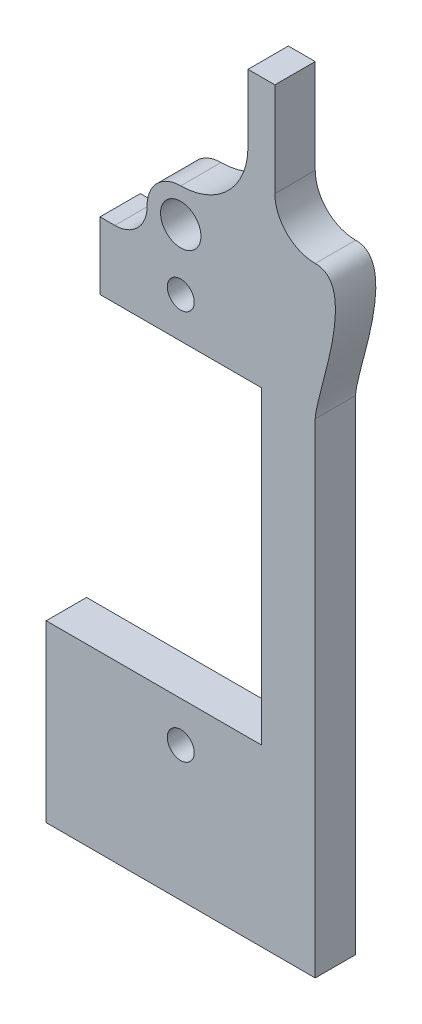
ISO-10303-21;
HEADER;
FILE_DESCRIPTION(('STEP AP214'),'2;1');
FILE_NAME('part.step','',(''),(''),'','','');
FILE_SCHEMA(('AUTOMOTIVE_DESIGN { 1 0 10303 214 1 1 1 1 }'));
ENDSEC;
DATA;
#1=APPLICATION_CONTEXT('core data for automotive mechanical design processes');
#2=APPLICATION_PROTOCOL_DEFINITION('international standard','automotive_design',2000,#1);
#3=PRODUCT_CONTEXT('',#1,'mechanical');
#4=PRODUCT('Part','Part','',(#3));
#5=PRODUCT_RELATED_PRODUCT_CATEGORY('part','',(#4));
#6=PRODUCT_DEFINITION_FORMATION('','',#4);
#7=PRODUCT_DEFINITION_CONTEXT('part definition',#1,'design');
#8=PRODUCT_DEFINITION('design','',#6,#7);
#9=PRODUCT_DEFINITION_SHAPE('','',#8);
#10=(LENGTH_UNIT() NAMED_UNIT(*) SI_UNIT(.MILLI.,.METRE.));
#11=(NAMED_UNIT(*) PLANE_ANGLE_UNIT() SI_UNIT($,.RADIAN.));
#12=(NAMED_UNIT(*) SI_UNIT($,.STERADIAN.) SOLID_ANGLE_UNIT());
#13=UNCERTAINTY_MEASURE_WITH_UNIT(LENGTH_MEASURE(1.E-05),#10,'distance_accuracy_value','');
#14=(GEOMETRIC_REPRESENTATION_CONTEXT(3) GLOBAL_UNCERTAINTY_ASSIGNED_CONTEXT((#13)) GLOBAL_UNIT_ASSIGNED_CONTEXT((#10,
#11,#12)) REPRESENTATION_CONTEXT('',''));
#15=CARTESIAN_POINT('',(0.,0.,0.));
#16=DIRECTION('',(0.,0.,1.));
#17=DIRECTION('',(1.,0.,0.));
#18=AXIS2_PLACEMENT_3D('',#15,#16,#17);
#19=CARTESIAN_POINT('',(-4.9,37.4,3.));
#20=DIRECTION('',(0.,0.,1.));
#21=DIRECTION('',(1.,0.,0.));
#22=AXIS2_PLACEMENT_3D('',#19,#20,#21);
#23=PLANE('',#22);
#24=CARTESIAN_POINT('',(0.,33.,3.));
#25=DIRECTION('',(0.,0.,1.));
#26=DIRECTION('',(1.,0.,0.));
#27=AXIS2_PLACEMENT_3D('',#24,#25,#26);
#28=CIRCLE('',#27,1.);
#29=CARTESIAN_POINT('',(1.,33.,3.));
#30=VERTEX_POINT('',#29);
#31=EDGE_CURVE('E404',#30,#30,#28,.T.);
#32=ORIENTED_EDGE('',*,*,#31,.F.);
#33=EDGE_LOOP('',(#32));
#34=FACE_BOUND('',#33,.T.);
#35=DIRECTION('',(0.,1.,0.));
#36=VECTOR('',#35,1.);
#37=CARTESIAN_POINT('',(10.,0.,3.));
#38=LINE('',#37,#36);
#39=CARTESIAN_POINT('',(9.99999999999999,-5.99999999999999,3.));
#40=VERTEX_POINT('',#39);
#41=CARTESIAN_POINT('',(10.,30.,3.));
#42=VERTEX_POINT('',#41);
#43=EDGE_CURVE('E117',#40,#42,#38,.T.);
#44=ORIENTED_EDGE('',*,*,#43,.T.);
#45=CARTESIAN_POINT('',(9.99999999999999,30.,3.));
#46=CARTESIAN_POINT('',(10.,31.6044227574687,3.));
#47=CARTESIAN_POINT('',(13.3824564635064,40.,3.));
#48=CARTESIAN_POINT('',(10.,40.,3.));
#49=B_SPLINE_CURVE_WITH_KNOTS('',3,(#45,#46,#47,#48),.UNSPECIFIED.,.F.,.F.,(4,4),(0.,1.),.UNSPECIFIED.);
#50=CARTESIAN_POINT('',(10.,40.,3.));
#51=VERTEX_POINT('',#50);
#52=EDGE_CURVE('E314',#42,#51,#49,.T.);
#53=ORIENTED_EDGE('',*,*,#52,.T.);
#54=CARTESIAN_POINT('',(10.,43.,3.));
#55=DIRECTION('',(0.,0.,-1.));
#56=DIRECTION('',(1.,0.,0.));
#57=AXIS2_PLACEMENT_3D('',#54,#55,#56);
#58=CIRCLE('',#57,3.);
#59=CARTESIAN_POINT('',(7.,43.,3.));
#60=VERTEX_POINT('',#59);
#61=EDGE_CURVE('E263',#51,#60,#58,.T.);
#62=ORIENTED_EDGE('',*,*,#61,.T.);
#63=DIRECTION('',(0.,1.,0.));
#64=VECTOR('',#63,1.);
#65=CARTESIAN_POINT('',(7.,50.,3.));
#66=LINE('',#65,#64);
#67=CARTESIAN_POINT('',(7.,50.,3.));
#68=VERTEX_POINT('',#67);
#69=EDGE_CURVE('E282',#60,#68,#66,.T.);
#70=ORIENTED_EDGE('',*,*,#69,.T.);
#71=DIRECTION('',(-1.,0.,0.));
#72=VECTOR('',#71,1.);
#73=CARTESIAN_POINT('',(5.,50.,3.));
#74=LINE('',#73,#72);
#75=CARTESIAN_POINT('',(5.,50.,3.));
#76=VERTEX_POINT('',#75);
#77=EDGE_CURVE('E279',#68,#76,#74,.T.);
#78=ORIENTED_EDGE('',*,*,#77,.T.);
#79=DIRECTION('',(0.,-1.,0.));
#80=VECTOR('',#79,1.);
#81=CARTESIAN_POINT('',(5.,45.,3.));
#82=LINE('',#81,#80);
#83=CARTESIAN_POINT('',(5.,45.,3.));
#84=VERTEX_POINT('',#83);
#85=EDGE_CURVE('E281',#76,#84,#82,.T.);
#86=ORIENTED_EDGE('',*,*,#85,.T.);
#87=CARTESIAN_POINT('',(0.,45.,3.));
#88=DIRECTION('',(0.,0.,-1.));
#89=DIRECTION('',(1.,0.,0.));
#90=AXIS2_PLACEMENT_3D('',#87,#88,#89);
#91=CIRCLE('',#90,5.);
#92=CARTESIAN_POINT('',(0.,40.,3.));
#93=VERTEX_POINT('',#92);
#94=EDGE_CURVE('E284',#84,#93,#91,.T.);
#95=ORIENTED_EDGE('',*,*,#94,.T.);
#96=CARTESIAN_POINT('',(0.,37.5,3.));
#97=DIRECTION('',(0.,0.,1.));
#98=DIRECTION('',(1.,0.,0.));
#99=AXIS2_PLACEMENT_3D('',#96,#97,#98);
#100=CIRCLE('',#99,2.5);
#101=CARTESIAN_POINT('',(-2.49999999999999,37.5,3.));
#102=VERTEX_POINT('',#101);
#103=EDGE_CURVE('E290',#93,#102,#100,.T.);
#104=ORIENTED_EDGE('',*,*,#103,.T.);
#105=DIRECTION('',(0.,-1.,0.));
#106=VECTOR('',#105,1.);
#107=CARTESIAN_POINT('',(-2.49999999999999,37.4,3.));
#108=LINE('',#107,#106);
#109=CARTESIAN_POINT('',(-2.49999999999999,37.4,3.));
#110=VERTEX_POINT('',#109);
#111=EDGE_CURVE('E292',#102,#110,#108,.T.);
#112=ORIENTED_EDGE('',*,*,#111,.T.);
#113=CARTESIAN_POINT('',(-4.9,37.4,3.));
#114=DIRECTION('',(0.,0.,-1.));
#115=DIRECTION('',(1.,0.,0.));
#116=AXIS2_PLACEMENT_3D('',#113,#114,#115);
#117=CIRCLE('',#116,2.4);
#118=CARTESIAN_POINT('',(-4.90000000000001,35.,3.));
#119=VERTEX_POINT('',#118);
#120=EDGE_CURVE('E294',#110,#119,#117,.T.);
#121=ORIENTED_EDGE('',*,*,#120,.T.);
#122=DIRECTION('',(-1.,0.,0.));
#123=VECTOR('',#122,1.);
#124=CARTESIAN_POINT('',(-6.,35.,3.));
#125=LINE('',#124,#123);
#126=CARTESIAN_POINT('',(-6.,35.,3.));
#127=VERTEX_POINT('',#126);
#128=EDGE_CURVE('E296',#119,#127,#125,.T.);
#129=ORIENTED_EDGE('',*,*,#128,.T.);
#130=DIRECTION('',(0.,-1.,0.));
#131=VECTOR('',#130,1.);
#132=CARTESIAN_POINT('',(-6.,35.,3.));
#133=LINE('',#132,#131);
#134=CARTESIAN_POINT('',(-6.,30.,3.));
#135=VERTEX_POINT('',#134);
#136=EDGE_CURVE('E298',#127,#135,#133,.T.);
#137=ORIENTED_EDGE('',*,*,#136,.T.);
#138=DIRECTION('',(1.,0.,0.));
#139=VECTOR('',#138,1.);
#140=CARTESIAN_POINT('',(-6.,30.,3.));
#141=LINE('',#140,#139);
#142=CARTESIAN_POINT('',(6.,30.,3.));
#143=VERTEX_POINT('',#142);
#144=EDGE_CURVE('E300',#135,#143,#141,.T.);
#145=ORIENTED_EDGE('',*,*,#144,.T.);
#146=DIRECTION('',(0.,-1.,0.));
#147=VECTOR('',#146,1.);
#148=CARTESIAN_POINT('',(6.,30.,3.));
#149=LINE('',#148,#147);
#150=CARTESIAN_POINT('',(6.,7.,3.));
#151=VERTEX_POINT('',#150);
#152=EDGE_CURVE('E164',#143,#151,#149,.T.);
#153=ORIENTED_EDGE('',*,*,#152,.T.);
#154=DIRECTION('',(-1.,0.,0.));
#155=VECTOR('',#154,1.);
#156=CARTESIAN_POINT('',(6.,7.,3.));
#157=LINE('',#156,#155);
#158=CARTESIAN_POINT('',(-10.,7.,3.));
#159=VERTEX_POINT('',#158);
#160=EDGE_CURVE('E158',#151,#159,#157,.T.);
#161=ORIENTED_EDGE('',*,*,#160,.T.);
#162=DIRECTION('',(0.,-1.,0.));
#163=VECTOR('',#162,1.);
#164=CARTESIAN_POINT('',(-10.,0.,3.));
#165=LINE('',#164,#163);
#166=CARTESIAN_POINT('',(-9.99999999999999,-5.99999999999999,3.));
#167=VERTEX_POINT('',#166);
#168=EDGE_CURVE('E162',#159,#167,#165,.T.);
#169=ORIENTED_EDGE('',*,*,#168,.T.);
#170=DIRECTION('',(1.,0.,0.));
#171=VECTOR('',#170,1.);
#172=CARTESIAN_POINT('',(-9.99999999999999,-5.99999999999999,3.));
#173=LINE('',#172,#171);
#174=EDGE_CURVE('E49',#167,#40,#173,.T.);
#175=ORIENTED_EDGE('',*,*,#174,.T.);
#176=EDGE_LOOP('',(#44,#53,#62,#70,#78,#86,#95,#104,#112,#121,#129,#137,#145,#153,#161,#169,#175));
#177=FACE_BOUND('',#176,.T.);
#178=CARTESIAN_POINT('',(0.,37.5,3.));
#179=DIRECTION('',(0.,0.,1.));
#180=DIRECTION('',(1.,0.,0.));
#181=AXIS2_PLACEMENT_3D('',#178,#179,#180);
#182=CIRCLE('',#181,1.5);
#183=CARTESIAN_POINT('',(1.5,37.5,3.));
#184=VERTEX_POINT('',#183);
#185=EDGE_CURVE('E185',#184,#184,#182,.T.);
#186=ORIENTED_EDGE('',*,*,#185,.F.);
#187=EDGE_LOOP('',(#186));
#188=FACE_BOUND('',#187,.T.);
#189=CARTESIAN_POINT('',(0.,4.,3.));
#190=DIRECTION('',(0.,0.,1.));
#191=DIRECTION('',(1.,0.,0.));
#192=AXIS2_PLACEMENT_3D('',#189,#190,#191);
#193=CIRCLE('',#192,1.);
#194=CARTESIAN_POINT('',(1.,4.,3.));
#195=VERTEX_POINT('',#194);
#196=EDGE_CURVE('E395',#195,#195,#193,.T.);
#197=ORIENTED_EDGE('',*,*,#196,.F.);
#198=EDGE_LOOP('',(#197));
#199=FACE_BOUND('',#198,.T.);
#200=ADVANCED_FACE('F32',(#34,#177,#188,#199),#23,.T.);
#201=CARTESIAN_POINT('',(-4.9,37.4,0.));
#202=DIRECTION('',(0.,0.,1.));
#203=DIRECTION('',(1.,0.,0.));
#204=AXIS2_PLACEMENT_3D('',#201,#202,#203);
#205=PLANE('',#204);
#206=CARTESIAN_POINT('',(0.,33.,0.));
#207=DIRECTION('',(0.,0.,1.));
#208=DIRECTION('',(1.,0.,0.));
#209=AXIS2_PLACEMENT_3D('',#206,#207,#208);
#210=CIRCLE('',#209,1.);
#211=CARTESIAN_POINT('',(1.,33.,0.));
#212=VERTEX_POINT('',#211);
#213=EDGE_CURVE('E401',#212,#212,#210,.T.);
#214=ORIENTED_EDGE('',*,*,#213,.T.);
#215=EDGE_LOOP('',(#214));
#216=FACE_BOUND('',#215,.T.);
#217=DIRECTION('',(0.,1.,0.));
#218=VECTOR('',#217,1.);
#219=CARTESIAN_POINT('',(10.,0.,0.));
#220=LINE('',#219,#218);
#221=CARTESIAN_POINT('',(9.99999999999999,-5.99999999999999,0.));
#222=VERTEX_POINT('',#221);
#223=CARTESIAN_POINT('',(10.,30.,0.));
#224=VERTEX_POINT('',#223);
#225=EDGE_CURVE('E111',#222,#224,#220,.T.);
#226=ORIENTED_EDGE('',*,*,#225,.F.);
#227=DIRECTION('',(1.,0.,0.));
#228=VECTOR('',#227,1.);
#229=CARTESIAN_POINT('',(-9.99999999999999,-5.99999999999999,0.));
#230=LINE('',#229,#228);
#231=CARTESIAN_POINT('',(-9.99999999999999,-5.99999999999999,0.));
#232=VERTEX_POINT('',#231);
#233=EDGE_CURVE('E218',#232,#222,#230,.T.);
#234=ORIENTED_EDGE('',*,*,#233,.F.);
#235=DIRECTION('',(0.,-1.,0.));
#236=VECTOR('',#235,1.);
#237=CARTESIAN_POINT('',(-10.,0.,0.));
#238=LINE('',#237,#236);
#239=CARTESIAN_POINT('',(-10.,7.,0.));
#240=VERTEX_POINT('',#239);
#241=EDGE_CURVE('E104',#240,#232,#238,.T.);
#242=ORIENTED_EDGE('',*,*,#241,.F.);
#243=DIRECTION('',(-1.,0.,0.));
#244=VECTOR('',#243,1.);
#245=CARTESIAN_POINT('',(6.,7.,0.));
#246=LINE('',#245,#244);
#247=CARTESIAN_POINT('',(6.,7.,0.));
#248=VERTEX_POINT('',#247);
#249=EDGE_CURVE('E173',#248,#240,#246,.T.);
#250=ORIENTED_EDGE('',*,*,#249,.F.);
#251=DIRECTION('',(0.,-1.,0.));
#252=VECTOR('',#251,1.);
#253=CARTESIAN_POINT('',(6.,30.,0.));
#254=LINE('',#253,#252);
#255=CARTESIAN_POINT('',(6.,30.,0.));
#256=VERTEX_POINT('',#255);
#257=EDGE_CURVE('E214',#256,#248,#254,.T.);
#258=ORIENTED_EDGE('',*,*,#257,.F.);
#259=DIRECTION('',(1.,0.,0.));
#260=VECTOR('',#259,1.);
#261=CARTESIAN_POINT('',(-6.,30.,0.));
#262=LINE('',#261,#260);
#263=CARTESIAN_POINT('',(-6.,30.,0.));
#264=VERTEX_POINT('',#263);
#265=EDGE_CURVE('E212',#264,#256,#262,.T.);
#266=ORIENTED_EDGE('',*,*,#265,.F.);
#267=DIRECTION('',(0.,-1.,0.));
#268=VECTOR('',#267,1.);
#269=CARTESIAN_POINT('',(-6.,35.,0.));
#270=LINE('',#269,#268);
#271=CARTESIAN_POINT('',(-6.,35.,0.));
#272=VERTEX_POINT('',#271);
#273=EDGE_CURVE('E210',#272,#264,#270,.T.);
#274=ORIENTED_EDGE('',*,*,#273,.F.);
#275=DIRECTION('',(-1.,0.,0.));
#276=VECTOR('',#275,1.);
#277=CARTESIAN_POINT('',(-6.,35.,0.));
#278=LINE('',#277,#276);
#279=CARTESIAN_POINT('',(-4.90000000000001,35.,0.));
#280=VERTEX_POINT('',#279);
#281=EDGE_CURVE('E208',#280,#272,#278,.T.);
#282=ORIENTED_EDGE('',*,*,#281,.F.);
#283=CARTESIAN_POINT('',(-4.9,37.4,0.));
#284=DIRECTION('',(0.,0.,-1.));
#285=DIRECTION('',(1.,0.,0.));
#286=AXIS2_PLACEMENT_3D('',#283,#284,#285);
#287=CIRCLE('',#286,2.4);
#288=CARTESIAN_POINT('',(-2.49999999999999,37.4,0.));
#289=VERTEX_POINT('',#288);
#290=EDGE_CURVE('E206',#289,#280,#287,.T.);
#291=ORIENTED_EDGE('',*,*,#290,.F.);
#292=DIRECTION('',(0.,-1.,0.));
#293=VECTOR('',#292,1.);
#294=CARTESIAN_POINT('',(-2.49999999999999,37.4,0.));
#295=LINE('',#294,#293);
#296=CARTESIAN_POINT('',(-2.49999999999999,37.5,0.));
#297=VERTEX_POINT('',#296);
#298=EDGE_CURVE('E204',#297,#289,#295,.T.);
#299=ORIENTED_EDGE('',*,*,#298,.F.);
#300=CARTESIAN_POINT('',(0.,37.5,0.));
#301=DIRECTION('',(0.,0.,1.));
#302=DIRECTION('',(1.,0.,0.));
#303=AXIS2_PLACEMENT_3D('',#300,#301,#302);
#304=CIRCLE('',#303,2.5);
#305=CARTESIAN_POINT('',(0.,40.,0.));
#306=VERTEX_POINT('',#305);
#307=EDGE_CURVE('E202',#306,#297,#304,.T.);
#308=ORIENTED_EDGE('',*,*,#307,.F.);
#309=CARTESIAN_POINT('',(0.,45.,0.));
#310=DIRECTION('',(0.,0.,-1.));
#311=DIRECTION('',(1.,0.,0.));
#312=AXIS2_PLACEMENT_3D('',#309,#310,#311);
#313=CIRCLE('',#312,5.);
#314=CARTESIAN_POINT('',(5.,45.,0.));
#315=VERTEX_POINT('',#314);
#316=EDGE_CURVE('E200',#315,#306,#313,.T.);
#317=ORIENTED_EDGE('',*,*,#316,.F.);
#318=DIRECTION('',(0.,-1.,0.));
#319=VECTOR('',#318,1.);
#320=CARTESIAN_POINT('',(5.,45.,0.));
#321=LINE('',#320,#319);
#322=CARTESIAN_POINT('',(5.,50.,0.));
#323=VERTEX_POINT('',#322);
#324=EDGE_CURVE('E198',#323,#315,#321,.T.);
#325=ORIENTED_EDGE('',*,*,#324,.F.);
#326=DIRECTION('',(-1.,0.,0.));
#327=VECTOR('',#326,1.);
#328=CARTESIAN_POINT('',(5.,50.,0.));
#329=LINE('',#328,#327);
#330=CARTESIAN_POINT('',(7.,50.,0.));
#331=VERTEX_POINT('',#330);
#332=EDGE_CURVE('E196',#331,#323,#329,.T.);
#333=ORIENTED_EDGE('',*,*,#332,.F.);
#334=DIRECTION('',(0.,1.,0.));
#335=VECTOR('',#334,1.);
#336=CARTESIAN_POINT('',(7.,50.,0.));
#337=LINE('',#336,#335);
#338=CARTESIAN_POINT('',(7.,43.,0.));
#339=VERTEX_POINT('',#338);
#340=EDGE_CURVE('E194',#339,#331,#337,.T.);
#341=ORIENTED_EDGE('',*,*,#340,.F.);
#342=CARTESIAN_POINT('',(10.,43.,0.));
#343=DIRECTION('',(0.,0.,-1.));
#344=DIRECTION('',(1.,0.,0.));
#345=AXIS2_PLACEMENT_3D('',#342,#343,#344);
#346=CIRCLE('',#345,3.);
#347=CARTESIAN_POINT('',(10.,40.,0.));
#348=VERTEX_POINT('',#347);
#349=EDGE_CURVE('E189',#348,#339,#346,.T.);
#350=ORIENTED_EDGE('',*,*,#349,.F.);
#351=CARTESIAN_POINT('',(9.99999999999999,30.,0.));
#352=CARTESIAN_POINT('',(10.,31.6044227574687,0.));
#353=CARTESIAN_POINT('',(13.3824564635064,40.,0.));
#354=CARTESIAN_POINT('',(10.,40.,0.));
#355=B_SPLINE_CURVE_WITH_KNOTS('',3,(#351,#352,#353,#354),.UNSPECIFIED.,.F.,.F.,(4,4),(0.,1.),.UNSPECIFIED.);
#356=EDGE_CURVE('E184',#224,#348,#355,.T.);
#357=ORIENTED_EDGE('',*,*,#356,.F.);
#358=EDGE_LOOP('',(#226,#234,#242,#250,#258,#266,#274,#282,#291,#299,#308,#317,#325,#333,#341,
#350,#357));
#359=FACE_BOUND('',#358,.T.);
#360=CARTESIAN_POINT('',(0.,37.5,0.));
#361=DIRECTION('',(0.,0.,1.));
#362=DIRECTION('',(1.,0.,0.));
#363=AXIS2_PLACEMENT_3D('',#360,#361,#362);
#364=CIRCLE('',#363,1.5);
#365=CARTESIAN_POINT('',(1.5,37.5,0.));
#366=VERTEX_POINT('',#365);
#367=EDGE_CURVE('E318',#366,#366,#364,.T.);
#368=ORIENTED_EDGE('',*,*,#367,.T.);
#369=EDGE_LOOP('',(#368));
#370=FACE_BOUND('',#369,.T.);
#371=CARTESIAN_POINT('',(0.,4.,0.));
#372=DIRECTION('',(0.,0.,1.));
#373=DIRECTION('',(1.,0.,0.));
#374=AXIS2_PLACEMENT_3D('',#371,#372,#373);
#375=CIRCLE('',#374,1.);
#376=CARTESIAN_POINT('',(1.,4.,0.));
#377=VERTEX_POINT('',#376);
#378=EDGE_CURVE('E398',#377,#377,#375,.T.);
#379=ORIENTED_EDGE('',*,*,#378,.T.);
#380=EDGE_LOOP('',(#379));
#381=FACE_BOUND('',#380,.T.);
#382=ADVANCED_FACE('F267',(#216,#359,#370,#381),#205,.F.);
#383=CARTESIAN_POINT('',(10.,0.,3.));
#384=DIRECTION('',(-1.,0.,0.));
#385=DIRECTION('',(0.,-1.,0.));
#386=AXIS2_PLACEMENT_3D('',#383,#384,#385);
#387=PLANE('',#386);
#388=ORIENTED_EDGE('',*,*,#225,.T.);
#389=DIRECTION('',(0.,0.,-1.));
#390=VECTOR('',#389,1.);
#391=CARTESIAN_POINT('',(10.,30.,3.));
#392=LINE('',#391,#390);
#393=EDGE_CURVE('E11',#42,#224,#392,.T.);
#394=ORIENTED_EDGE('',*,*,#393,.F.);
#395=ORIENTED_EDGE('',*,*,#43,.F.);
#396=DIRECTION('',(0.,0.,-1.));
#397=VECTOR('',#396,1.);
#398=CARTESIAN_POINT('',(9.99999999999999,-5.99999999999999,3.));
#399=LINE('',#398,#397);
#400=EDGE_CURVE('E179',#40,#222,#399,.T.);
#401=ORIENTED_EDGE('',*,*,#400,.T.);
#402=EDGE_LOOP('',(#388,#394,#395,#401));
#403=FACE_BOUND('',#402,.T.);
#404=ADVANCED_FACE('F34',(#403),#387,.F.);
#405=DIRECTION('',(0.,0.,-1.));
#406=VECTOR('',#405,1.);
#407=SURFACE_OF_LINEAR_EXTRUSION('',#49,#406);
#408=ORIENTED_EDGE('',*,*,#356,.T.);
#409=DIRECTION('',(0.,0.,-1.));
#410=VECTOR('',#409,1.);
#411=CARTESIAN_POINT('',(10.,40.,3.));
#412=LINE('',#411,#410);
#413=EDGE_CURVE('E41',#51,#348,#412,.T.);
#414=ORIENTED_EDGE('',*,*,#413,.F.);
#415=ORIENTED_EDGE('',*,*,#52,.F.);
#416=ORIENTED_EDGE('',*,*,#393,.T.);
#417=EDGE_LOOP('',(#408,#414,#415,#416));
#418=FACE_BOUND('',#417,.T.);
#419=ADVANCED_FACE('F326',(#418),#407,.F.);
#420=CARTESIAN_POINT('',(10.,43.,3.));
#421=DIRECTION('',(0.,0.,-1.));
#422=DIRECTION('',(-1.,0.,0.));
#423=AXIS2_PLACEMENT_3D('',#420,#421,#422);
#424=CYLINDRICAL_SURFACE('',#423,3.);
#425=ORIENTED_EDGE('',*,*,#349,.T.);
#426=DIRECTION('',(0.,0.,-1.));
#427=VECTOR('',#426,1.);
#428=CARTESIAN_POINT('',(7.,43.,3.));
#429=LINE('',#428,#427);
#430=EDGE_CURVE('E254',#60,#339,#429,.T.);
#431=ORIENTED_EDGE('',*,*,#430,.F.);
#432=ORIENTED_EDGE('',*,*,#61,.F.);
#433=ORIENTED_EDGE('',*,*,#413,.T.);
#434=EDGE_LOOP('',(#425,#431,#432,#433));
#435=FACE_BOUND('',#434,.T.);
#436=ADVANCED_FACE('F261',(#435),#424,.F.);
#437=CARTESIAN_POINT('',(7.,50.,3.));
#438=DIRECTION('',(-1.,0.,0.));
#439=DIRECTION('',(0.,0.,1.));
#440=AXIS2_PLACEMENT_3D('',#437,#438,#439);
#441=PLANE('',#440);
#442=ORIENTED_EDGE('',*,*,#340,.T.);
#443=DIRECTION('',(0.,0.,-1.));
#444=VECTOR('',#443,1.);
#445=CARTESIAN_POINT('',(7.,50.,3.));
#446=LINE('',#445,#444);
#447=EDGE_CURVE('E251',#68,#331,#446,.T.);
#448=ORIENTED_EDGE('',*,*,#447,.F.);
#449=ORIENTED_EDGE('',*,*,#69,.F.);
#450=ORIENTED_EDGE('',*,*,#430,.T.);
#451=EDGE_LOOP('',(#442,#448,#449,#450));
#452=FACE_BOUND('',#451,.T.);
#453=ADVANCED_FACE('F273',(#452),#441,.F.);
#454=CARTESIAN_POINT('',(5.,50.,3.));
#455=DIRECTION('',(0.,-1.,0.));
#456=DIRECTION('',(0.,0.,-1.));
#457=AXIS2_PLACEMENT_3D('',#454,#455,#456);
#458=PLANE('',#457);
#459=ORIENTED_EDGE('',*,*,#332,.T.);
#460=DIRECTION('',(0.,0.,-1.));
#461=VECTOR('',#460,1.);
#462=CARTESIAN_POINT('',(5.,50.,3.));
#463=LINE('',#462,#461);
#464=EDGE_CURVE('E248',#76,#323,#463,.T.);
#465=ORIENTED_EDGE('',*,*,#464,.F.);
#466=ORIENTED_EDGE('',*,*,#77,.F.);
#467=ORIENTED_EDGE('',*,*,#447,.T.);
#468=EDGE_LOOP('',(#459,#465,#466,#467));
#469=FACE_BOUND('',#468,.T.);
#470=ADVANCED_FACE('F277',(#469),#458,.F.);
#471=CARTESIAN_POINT('',(5.,45.,3.));
#472=DIRECTION('',(1.,0.,0.));
#473=DIRECTION('',(0.,0.,-1.));
#474=AXIS2_PLACEMENT_3D('',#471,#472,#473);
#475=PLANE('',#474);
#476=ORIENTED_EDGE('',*,*,#324,.T.);
#477=DIRECTION('',(0.,0.,-1.));
#478=VECTOR('',#477,1.);
#479=CARTESIAN_POINT('',(5.,45.,3.));
#480=LINE('',#479,#478);
#481=EDGE_CURVE('E245',#84,#315,#480,.T.);
#482=ORIENTED_EDGE('',*,*,#481,.F.);
#483=ORIENTED_EDGE('',*,*,#85,.F.);
#484=ORIENTED_EDGE('',*,*,#464,.T.);
#485=EDGE_LOOP('',(#476,#482,#483,#484));
#486=FACE_BOUND('',#485,.T.);
#487=ADVANCED_FACE('F335',(#486),#475,.F.);
#488=CARTESIAN_POINT('',(0.,45.,3.));
#489=DIRECTION('',(0.,0.,-1.));
#490=DIRECTION('',(-1.,0.,0.));
#491=AXIS2_PLACEMENT_3D('',#488,#489,#490);
#492=CYLINDRICAL_SURFACE('',#491,5.);
#493=ORIENTED_EDGE('',*,*,#316,.T.);
#494=DIRECTION('',(0.,0.,-1.));
#495=VECTOR('',#494,1.);
#496=CARTESIAN_POINT('',(0.,40.,3.));
#497=LINE('',#496,#495);
#498=EDGE_CURVE('E242',#93,#306,#497,.T.);
#499=ORIENTED_EDGE('',*,*,#498,.F.);
#500=ORIENTED_EDGE('',*,*,#94,.F.);
#501=ORIENTED_EDGE('',*,*,#481,.T.);
#502=EDGE_LOOP('',(#493,#499,#500,#501));
#503=FACE_BOUND('',#502,.T.);
#504=ADVANCED_FACE('F338',(#503),#492,.F.);
#505=CARTESIAN_POINT('',(0.,37.5,3.));
#506=DIRECTION('',(0.,0.,-1.));
#507=DIRECTION('',(-1.,0.,0.));
#508=AXIS2_PLACEMENT_3D('',#505,#506,#507);
#509=CYLINDRICAL_SURFACE('',#508,2.5);
#510=ORIENTED_EDGE('',*,*,#307,.T.);
#511=DIRECTION('',(0.,0.,-1.));
#512=VECTOR('',#511,1.);
#513=CARTESIAN_POINT('',(-2.49999999999999,37.5,3.));
#514=LINE('',#513,#512);
#515=EDGE_CURVE('E239',#102,#297,#514,.T.);
#516=ORIENTED_EDGE('',*,*,#515,.F.);
#517=ORIENTED_EDGE('',*,*,#103,.F.);
#518=ORIENTED_EDGE('',*,*,#498,.T.);
#519=EDGE_LOOP('',(#510,#516,#517,#518));
#520=FACE_BOUND('',#519,.T.);
#521=ADVANCED_FACE('F342',(#520),#509,.T.);
#522=CARTESIAN_POINT('',(-2.49999999999999,37.4,3.));
#523=DIRECTION('',(1.,0.,0.));
#524=DIRECTION('',(0.,0.,-1.));
#525=AXIS2_PLACEMENT_3D('',#522,#523,#524);
#526=PLANE('',#525);
#527=ORIENTED_EDGE('',*,*,#298,.T.);
#528=DIRECTION('',(0.,0.,-1.));
#529=VECTOR('',#528,1.);
#530=CARTESIAN_POINT('',(-2.49999999999999,37.4,3.));
#531=LINE('',#530,#529);
#532=EDGE_CURVE('E236',#110,#289,#531,.T.);
#533=ORIENTED_EDGE('',*,*,#532,.F.);
#534=ORIENTED_EDGE('',*,*,#111,.F.);
#535=ORIENTED_EDGE('',*,*,#515,.T.);
#536=EDGE_LOOP('',(#527,#533,#534,#535));
#537=FACE_BOUND('',#536,.T.);
#538=ADVANCED_FACE('F346',(#537),#526,.F.);
#539=CARTESIAN_POINT('',(-4.9,37.4,3.));
#540=DIRECTION('',(0.,0.,-1.));
#541=DIRECTION('',(-1.,0.,0.));
#542=AXIS2_PLACEMENT_3D('',#539,#540,#541);
#543=CYLINDRICAL_SURFACE('',#542,2.4);
#544=ORIENTED_EDGE('',*,*,#290,.T.);
#545=DIRECTION('',(0.,0.,-1.));
#546=VECTOR('',#545,1.);
#547=CARTESIAN_POINT('',(-4.90000000000001,35.,3.));
#548=LINE('',#547,#546);
#549=EDGE_CURVE('E233',#119,#280,#548,.T.);
#550=ORIENTED_EDGE('',*,*,#549,.F.);
#551=ORIENTED_EDGE('',*,*,#120,.F.);
#552=ORIENTED_EDGE('',*,*,#532,.T.);
#553=EDGE_LOOP('',(#544,#550,#551,#552));
#554=FACE_BOUND('',#553,.T.);
#555=ADVANCED_FACE('F350',(#554),#543,.F.);
#556=CARTESIAN_POINT('',(-6.,35.,3.));
#557=DIRECTION('',(0.,-1.,0.));
#558=DIRECTION('',(0.,0.,-1.));
#559=AXIS2_PLACEMENT_3D('',#556,#557,#558);
#560=PLANE('',#559);
#561=ORIENTED_EDGE('',*,*,#281,.T.);
#562=DIRECTION('',(0.,0.,-1.));
#563=VECTOR('',#562,1.);
#564=CARTESIAN_POINT('',(-6.,35.,3.));
#565=LINE('',#564,#563);
#566=EDGE_CURVE('E230',#127,#272,#565,.T.);
#567=ORIENTED_EDGE('',*,*,#566,.F.);
#568=ORIENTED_EDGE('',*,*,#128,.F.);
#569=ORIENTED_EDGE('',*,*,#549,.T.);
#570=EDGE_LOOP('',(#561,#567,#568,#569));
#571=FACE_BOUND('',#570,.T.);
#572=ADVANCED_FACE('F354',(#571),#560,.F.);
#573=CARTESIAN_POINT('',(-6.,35.,3.));
#574=DIRECTION('',(1.,0.,0.));
#575=DIRECTION('',(0.,0.,-1.));
#576=AXIS2_PLACEMENT_3D('',#573,#574,#575);
#577=PLANE('',#576);
#578=ORIENTED_EDGE('',*,*,#273,.T.);
#579=DIRECTION('',(0.,0.,-1.));
#580=VECTOR('',#579,1.);
#581=CARTESIAN_POINT('',(-6.,30.,3.));
#582=LINE('',#581,#580);
#583=EDGE_CURVE('E227',#135,#264,#582,.T.);
#584=ORIENTED_EDGE('',*,*,#583,.F.);
#585=ORIENTED_EDGE('',*,*,#136,.F.);
#586=ORIENTED_EDGE('',*,*,#566,.T.);
#587=EDGE_LOOP('',(#578,#584,#585,#586));
#588=FACE_BOUND('',#587,.T.);
#589=ADVANCED_FACE('F358',(#588),#577,.F.);
#590=CARTESIAN_POINT('',(-6.,30.,3.));
#591=DIRECTION('',(0.,1.,0.));
#592=DIRECTION('',(0.,0.,1.));
#593=AXIS2_PLACEMENT_3D('',#590,#591,#592);
#594=PLANE('',#593);
#595=ORIENTED_EDGE('',*,*,#265,.T.);
#596=DIRECTION('',(0.,0.,-1.));
#597=VECTOR('',#596,1.);
#598=CARTESIAN_POINT('',(6.,30.,3.));
#599=LINE('',#598,#597);
#600=EDGE_CURVE('E224',#143,#256,#599,.T.);
#601=ORIENTED_EDGE('',*,*,#600,.F.);
#602=ORIENTED_EDGE('',*,*,#144,.F.);
#603=ORIENTED_EDGE('',*,*,#583,.T.);
#604=EDGE_LOOP('',(#595,#601,#602,#603));
#605=FACE_BOUND('',#604,.T.);
#606=ADVANCED_FACE('F306',(#605),#594,.F.);
#607=CARTESIAN_POINT('',(6.,30.,3.));
#608=DIRECTION('',(1.,0.,0.));
#609=DIRECTION('',(0.,0.,-1.));
#610=AXIS2_PLACEMENT_3D('',#607,#608,#609);
#611=PLANE('',#610);
#612=ORIENTED_EDGE('',*,*,#257,.T.);
#613=DIRECTION('',(0.,0.,-1.));
#614=VECTOR('',#613,1.);
#615=CARTESIAN_POINT('',(6.,7.,3.));
#616=LINE('',#615,#614);
#617=EDGE_CURVE('E174',#151,#248,#616,.T.);
#618=ORIENTED_EDGE('',*,*,#617,.F.);
#619=ORIENTED_EDGE('',*,*,#152,.F.);
#620=ORIENTED_EDGE('',*,*,#600,.T.);
#621=EDGE_LOOP('',(#612,#618,#619,#620));
#622=FACE_BOUND('',#621,.T.);
#623=ADVANCED_FACE('F310',(#622),#611,.F.);
#624=CARTESIAN_POINT('',(6.,7.,3.));
#625=DIRECTION('',(0.,-1.,0.));
#626=DIRECTION('',(0.,0.,-1.));
#627=AXIS2_PLACEMENT_3D('',#624,#625,#626);
#628=PLANE('',#627);
#629=ORIENTED_EDGE('',*,*,#249,.T.);
#630=DIRECTION('',(0.,0.,-1.));
#631=VECTOR('',#630,1.);
#632=CARTESIAN_POINT('',(-10.,7.,3.));
#633=LINE('',#632,#631);
#634=EDGE_CURVE('E170',#159,#240,#633,.T.);
#635=ORIENTED_EDGE('',*,*,#634,.F.);
#636=ORIENTED_EDGE('',*,*,#160,.F.);
#637=ORIENTED_EDGE('',*,*,#617,.T.);
#638=EDGE_LOOP('',(#629,#635,#636,#637));
#639=FACE_BOUND('',#638,.T.);
#640=ADVANCED_FACE('F171',(#639),#628,.F.);
#641=CARTESIAN_POINT('',(-10.,0.,3.));
#642=DIRECTION('',(1.,0.,0.));
#643=DIRECTION('',(0.,1.,0.));
#644=AXIS2_PLACEMENT_3D('',#641,#642,#643);
#645=PLANE('',#644);
#646=ORIENTED_EDGE('',*,*,#241,.T.);
#647=DIRECTION('',(0.,0.,-1.));
#648=VECTOR('',#647,1.);
#649=CARTESIAN_POINT('',(-9.99999999999999,-5.99999999999999,3.));
#650=LINE('',#649,#648);
#651=EDGE_CURVE('E175',#167,#232,#650,.T.);
#652=ORIENTED_EDGE('',*,*,#651,.F.);
#653=ORIENTED_EDGE('',*,*,#168,.F.);
#654=ORIENTED_EDGE('',*,*,#634,.T.);
#655=EDGE_LOOP('',(#646,#652,#653,#654));
#656=FACE_BOUND('',#655,.T.);
#657=ADVANCED_FACE('F177',(#656),#645,.F.);
#658=CARTESIAN_POINT('',(-9.99999999999999,-5.99999999999999,3.));
#659=DIRECTION('',(0.,1.,0.));
#660=DIRECTION('',(0.,0.,1.));
#661=AXIS2_PLACEMENT_3D('',#658,#659,#660);
#662=PLANE('',#661);
#663=ORIENTED_EDGE('',*,*,#233,.T.);
#664=ORIENTED_EDGE('',*,*,#400,.F.);
#665=ORIENTED_EDGE('',*,*,#174,.F.);
#666=ORIENTED_EDGE('',*,*,#651,.T.);
#667=EDGE_LOOP('',(#663,#664,#665,#666));
#668=FACE_BOUND('',#667,.T.);
#669=ADVANCED_FACE('F312',(#668),#662,.F.);
#670=CARTESIAN_POINT('',(0.,37.5,3.));
#671=DIRECTION('',(0.,0.,-1.));
#672=DIRECTION('',(-1.,0.,0.));
#673=AXIS2_PLACEMENT_3D('',#670,#671,#672);
#674=CYLINDRICAL_SURFACE('',#673,1.5);
#675=ORIENTED_EDGE('',*,*,#185,.T.);
#676=EDGE_LOOP('',(#675));
#677=FACE_BOUND('',#676,.T.);
#678=ORIENTED_EDGE('',*,*,#367,.F.);
#679=EDGE_LOOP('',(#678));
#680=FACE_BOUND('',#679,.T.);
#681=ADVANCED_FACE('F373',(#677,#680),#674,.F.);
#682=CARTESIAN_POINT('',(0.,33.,3.));
#683=DIRECTION('',(0.,0.,-1.));
#684=DIRECTION('',(-1.,0.,0.));
#685=AXIS2_PLACEMENT_3D('',#682,#683,#684);
#686=CYLINDRICAL_SURFACE('',#685,1.);
#687=ORIENTED_EDGE('',*,*,#31,.T.);
#688=EDGE_LOOP('',(#687));
#689=FACE_BOUND('',#688,.T.);
#690=ORIENTED_EDGE('',*,*,#213,.F.);
#691=EDGE_LOOP('',(#690));
#692=FACE_BOUND('',#691,.T.);
#693=ADVANCED_FACE('F382',(#689,#692),#686,.F.);
#694=CARTESIAN_POINT('',(0.,4.,3.));
#695=DIRECTION('',(0.,0.,-1.));
#696=DIRECTION('',(-1.,0.,0.));
#697=AXIS2_PLACEMENT_3D('',#694,#695,#696);
#698=CYLINDRICAL_SURFACE('',#697,1.);
#699=ORIENTED_EDGE('',*,*,#196,.T.);
#700=EDGE_LOOP('',(#699));
#701=FACE_BOUND('',#700,.T.);
#702=ORIENTED_EDGE('',*,*,#378,.F.);
#703=EDGE_LOOP('',(#702));
#704=FACE_BOUND('',#703,.T.);
#705=ADVANCED_FACE('F386',(#701,#704),#698,.F.);
#706=CLOSED_SHELL('',(#200,#382,#404,#419,#436,#453,#470,#487,#504,#521,#538,#555,#572,#589,
#606,#623,#640,#657,#669,#681,#693,#705));
#707=MANIFOLD_SOLID_BREP('B2',#706);
#708=ADVANCED_BREP_SHAPE_REPRESENTATION('',(#18,#707),#14);
#709=SHAPE_DEFINITION_REPRESENTATION(#9,#708);
ENDSEC;
END-ISO-10303-21;
